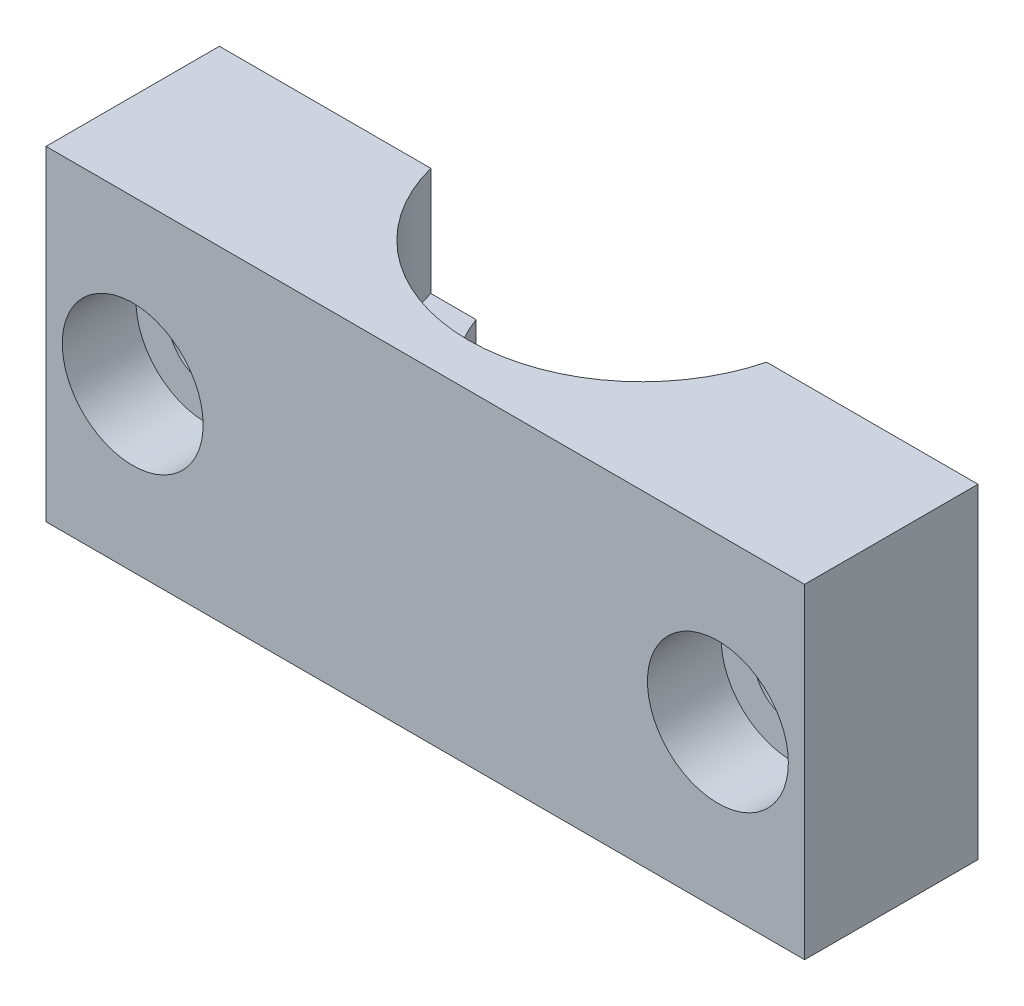
ISO-10303-21;
HEADER;
FILE_DESCRIPTION(('STEP AP214'),'2;1');
FILE_NAME('part.step','',(''),(''),'','','');
FILE_SCHEMA(('AUTOMOTIVE_DESIGN { 1 0 10303 214 1 1 1 1 }'));
ENDSEC;
DATA;
#1=APPLICATION_CONTEXT('core data for automotive mechanical design processes');
#2=APPLICATION_PROTOCOL_DEFINITION('international standard','automotive_design',2000,#1);
#3=PRODUCT_CONTEXT('',#1,'mechanical');
#4=PRODUCT('Part','Part','',(#3));
#5=PRODUCT_RELATED_PRODUCT_CATEGORY('part','',(#4));
#6=PRODUCT_DEFINITION_FORMATION('','',#4);
#7=PRODUCT_DEFINITION_CONTEXT('part definition',#1,'design');
#8=PRODUCT_DEFINITION('design','',#6,#7);
#9=PRODUCT_DEFINITION_SHAPE('','',#8);
#10=(LENGTH_UNIT() NAMED_UNIT(*) SI_UNIT(.MILLI.,.METRE.));
#11=(NAMED_UNIT(*) PLANE_ANGLE_UNIT() SI_UNIT($,.RADIAN.));
#12=(NAMED_UNIT(*) SI_UNIT($,.STERADIAN.) SOLID_ANGLE_UNIT());
#13=UNCERTAINTY_MEASURE_WITH_UNIT(LENGTH_MEASURE(1.E-05),#10,'distance_accuracy_value','');
#14=(GEOMETRIC_REPRESENTATION_CONTEXT(3) GLOBAL_UNCERTAINTY_ASSIGNED_CONTEXT((#13)) GLOBAL_UNIT_ASSIGNED_CONTEXT((#10,
#11,#12)) REPRESENTATION_CONTEXT('',''));
#15=CARTESIAN_POINT('',(0.,0.,0.));
#16=DIRECTION('',(0.,0.,1.));
#17=DIRECTION('',(1.,0.,0.));
#18=AXIS2_PLACEMENT_3D('',#15,#16,#17);
#19=CARTESIAN_POINT('',(17.5,-7.5,10.));
#20=DIRECTION('',(-1.,0.,0.));
#21=DIRECTION('',(0.,0.,1.));
#22=AXIS2_PLACEMENT_3D('',#19,#20,#21);
#23=PLANE('',#22);
#24=DIRECTION('',(0.,0.,-1.));
#25=VECTOR('',#24,1.);
#26=CARTESIAN_POINT('',(17.5,-7.5,10.));
#27=LINE('',#26,#25);
#28=CARTESIAN_POINT('',(17.5,-7.5,10.));
#29=VERTEX_POINT('',#28);
#30=CARTESIAN_POINT('',(17.5,-7.5,2.));
#31=VERTEX_POINT('',#30);
#32=EDGE_CURVE('E135',#29,#31,#27,.T.);
#33=ORIENTED_EDGE('',*,*,#32,.T.);
#34=DIRECTION('',(0.,1.,0.));
#35=VECTOR('',#34,1.);
#36=CARTESIAN_POINT('',(17.5,-7.5,2.));
#37=LINE('',#36,#35);
#38=CARTESIAN_POINT('',(17.5,7.5,2.));
#39=VERTEX_POINT('',#38);
#40=EDGE_CURVE('E130',#31,#39,#37,.T.);
#41=ORIENTED_EDGE('',*,*,#40,.T.);
#42=DIRECTION('',(0.,0.,-1.));
#43=VECTOR('',#42,1.);
#44=CARTESIAN_POINT('',(17.5,7.5,10.));
#45=LINE('',#44,#43);
#46=CARTESIAN_POINT('',(17.5,7.5,10.));
#47=VERTEX_POINT('',#46);
#48=EDGE_CURVE('E11',#47,#39,#45,.T.);
#49=ORIENTED_EDGE('',*,*,#48,.F.);
#50=DIRECTION('',(0.,1.,0.));
#51=VECTOR('',#50,1.);
#52=CARTESIAN_POINT('',(17.5,-7.5,10.));
#53=LINE('',#52,#51);
#54=EDGE_CURVE('E182',#29,#47,#53,.T.);
#55=ORIENTED_EDGE('',*,*,#54,.F.);
#56=EDGE_LOOP('',(#33,#41,#49,#55));
#57=FACE_BOUND('',#56,.T.);
#58=ADVANCED_FACE('F35',(#57),#23,.F.);
#59=CARTESIAN_POINT('',(-17.5,7.5,10.));
#60=DIRECTION('',(0.,-1.,0.));
#61=DIRECTION('',(0.,0.,-1.));
#62=AXIS2_PLACEMENT_3D('',#59,#60,#61);
#63=PLANE('',#62);
#64=ORIENTED_EDGE('',*,*,#48,.T.);
#65=DIRECTION('',(1.,0.,0.));
#66=VECTOR('',#65,1.);
#67=CARTESIAN_POINT('',(17.5,7.5,2.));
#68=LINE('',#67,#66);
#69=CARTESIAN_POINT('',(7.74596669241484,7.5,2.));
#70=VERTEX_POINT('',#69);
#71=EDGE_CURVE('E197',#70,#39,#68,.T.);
#72=ORIENTED_EDGE('',*,*,#71,.F.);
#73=CARTESIAN_POINT('',(0.,7.5,0.));
#74=DIRECTION('',(0.,-1.,0.));
#75=DIRECTION('',(0.,0.,-1.));
#76=AXIS2_PLACEMENT_3D('',#73,#74,#75);
#77=CIRCLE('',#76,8.);
#78=CARTESIAN_POINT('',(-7.74596669241483,7.5,2.));
#79=VERTEX_POINT('',#78);
#80=EDGE_CURVE('E179',#70,#79,#77,.T.);
#81=ORIENTED_EDGE('',*,*,#80,.T.);
#82=CARTESIAN_POINT('',(-17.5,7.5,2.));
#83=VERTEX_POINT('',#82);
#84=EDGE_CURVE('E199',#83,#79,#68,.T.);
#85=ORIENTED_EDGE('',*,*,#84,.F.);
#86=DIRECTION('',(0.,0.,-1.));
#87=VECTOR('',#86,1.);
#88=CARTESIAN_POINT('',(-17.5,7.5,10.));
#89=LINE('',#88,#87);
#90=CARTESIAN_POINT('',(-17.5,7.5,10.));
#91=VERTEX_POINT('',#90);
#92=EDGE_CURVE('E43',#91,#83,#89,.T.);
#93=ORIENTED_EDGE('',*,*,#92,.F.);
#94=DIRECTION('',(-1.,0.,0.));
#95=VECTOR('',#94,1.);
#96=CARTESIAN_POINT('',(-17.5,7.5,10.));
#97=LINE('',#96,#95);
#98=EDGE_CURVE('E185',#47,#91,#97,.T.);
#99=ORIENTED_EDGE('',*,*,#98,.F.);
#100=EDGE_LOOP('',(#64,#72,#81,#85,#93,#99));
#101=FACE_BOUND('',#100,.T.);
#102=ADVANCED_FACE('F196',(#101),#63,.F.);
#103=CARTESIAN_POINT('',(-17.5,-7.5,10.));
#104=DIRECTION('',(1.,0.,0.));
#105=DIRECTION('',(0.,0.,-1.));
#106=AXIS2_PLACEMENT_3D('',#103,#104,#105);
#107=PLANE('',#106);
#108=ORIENTED_EDGE('',*,*,#92,.T.);
#109=DIRECTION('',(0.,1.,0.));
#110=VECTOR('',#109,1.);
#111=CARTESIAN_POINT('',(-17.5,-7.5,2.));
#112=LINE('',#111,#110);
#113=CARTESIAN_POINT('',(-17.5,-7.5,2.));
#114=VERTEX_POINT('',#113);
#115=EDGE_CURVE('E114',#114,#83,#112,.T.);
#116=ORIENTED_EDGE('',*,*,#115,.F.);
#117=DIRECTION('',(0.,0.,-1.));
#118=VECTOR('',#117,1.);
#119=CARTESIAN_POINT('',(-17.5,-7.5,10.));
#120=LINE('',#119,#118);
#121=CARTESIAN_POINT('',(-17.5,-7.5,10.));
#122=VERTEX_POINT('',#121);
#123=EDGE_CURVE('E127',#122,#114,#120,.T.);
#124=ORIENTED_EDGE('',*,*,#123,.F.);
#125=DIRECTION('',(0.,-1.,0.));
#126=VECTOR('',#125,1.);
#127=CARTESIAN_POINT('',(-17.5,-7.5,10.));
#128=LINE('',#127,#126);
#129=EDGE_CURVE('E187',#91,#122,#128,.T.);
#130=ORIENTED_EDGE('',*,*,#129,.F.);
#131=EDGE_LOOP('',(#108,#116,#124,#130));
#132=FACE_BOUND('',#131,.T.);
#133=ADVANCED_FACE('F125',(#132),#107,.F.);
#134=CARTESIAN_POINT('',(-17.5,-7.5,10.));
#135=DIRECTION('',(0.,1.,0.));
#136=DIRECTION('',(0.,0.,1.));
#137=AXIS2_PLACEMENT_3D('',#134,#135,#136);
#138=PLANE('',#137);
#139=ORIENTED_EDGE('',*,*,#123,.T.);
#140=DIRECTION('',(1.,0.,0.));
#141=VECTOR('',#140,1.);
#142=CARTESIAN_POINT('',(17.5,-7.5,2.));
#143=LINE('',#142,#141);
#144=CARTESIAN_POINT('',(-7.74596669241483,-7.5,2.));
#145=VERTEX_POINT('',#144);
#146=EDGE_CURVE('E111',#114,#145,#143,.T.);
#147=ORIENTED_EDGE('',*,*,#146,.T.);
#148=CARTESIAN_POINT('',(0.,-7.5,0.));
#149=DIRECTION('',(0.,-1.,0.));
#150=DIRECTION('',(0.,0.,-1.));
#151=AXIS2_PLACEMENT_3D('',#148,#149,#150);
#152=CIRCLE('',#151,8.);
#153=CARTESIAN_POINT('',(7.74596669241484,-7.5,2.));
#154=VERTEX_POINT('',#153);
#155=EDGE_CURVE('E144',#154,#145,#152,.T.);
#156=ORIENTED_EDGE('',*,*,#155,.F.);
#157=EDGE_CURVE('E59',#154,#31,#143,.T.);
#158=ORIENTED_EDGE('',*,*,#157,.T.);
#159=ORIENTED_EDGE('',*,*,#32,.F.);
#160=DIRECTION('',(1.,0.,0.));
#161=VECTOR('',#160,1.);
#162=CARTESIAN_POINT('',(-17.5,-7.5,10.));
#163=LINE('',#162,#161);
#164=EDGE_CURVE('E134',#122,#29,#163,.T.);
#165=ORIENTED_EDGE('',*,*,#164,.F.);
#166=EDGE_LOOP('',(#139,#147,#156,#158,#159,#165));
#167=FACE_BOUND('',#166,.T.);
#168=ADVANCED_FACE('F132',(#167),#138,.F.);
#169=CARTESIAN_POINT('',(0.,0.,10.));
#170=DIRECTION('',(0.,0.,-1.));
#171=DIRECTION('',(-1.,0.,0.));
#172=AXIS2_PLACEMENT_3D('',#169,#170,#171);
#173=PLANE('',#172);
#174=CARTESIAN_POINT('',(-13.5,0.,10.));
#175=DIRECTION('',(0.,0.,1.));
#176=DIRECTION('',(1.,0.,0.));
#177=AXIS2_PLACEMENT_3D('',#174,#175,#176);
#178=CIRCLE('',#177,3.25);
#179=CARTESIAN_POINT('',(-10.25,0.,10.));
#180=VERTEX_POINT('',#179);
#181=EDGE_CURVE('E155',#180,#180,#178,.T.);
#182=ORIENTED_EDGE('',*,*,#181,.F.);
#183=EDGE_LOOP('',(#182));
#184=FACE_BOUND('',#183,.T.);
#185=CARTESIAN_POINT('',(13.5,0.,10.));
#186=DIRECTION('',(0.,0.,1.));
#187=DIRECTION('',(1.,0.,0.));
#188=AXIS2_PLACEMENT_3D('',#185,#186,#187);
#189=CIRCLE('',#188,3.25);
#190=CARTESIAN_POINT('',(16.75,0.,10.));
#191=VERTEX_POINT('',#190);
#192=EDGE_CURVE('E148',#191,#191,#189,.T.);
#193=ORIENTED_EDGE('',*,*,#192,.F.);
#194=EDGE_LOOP('',(#193));
#195=FACE_BOUND('',#194,.T.);
#196=ORIENTED_EDGE('',*,*,#54,.T.);
#197=ORIENTED_EDGE('',*,*,#98,.T.);
#198=ORIENTED_EDGE('',*,*,#129,.T.);
#199=ORIENTED_EDGE('',*,*,#164,.T.);
#200=EDGE_LOOP('',(#196,#197,#198,#199));
#201=FACE_BOUND('',#200,.T.);
#202=ADVANCED_FACE('F189',(#184,#195,#201),#173,.F.);
#203=CARTESIAN_POINT('',(0.,7.5,0.));
#204=DIRECTION('',(0.,-1.,0.));
#205=DIRECTION('',(0.,0.,-1.));
#206=AXIS2_PLACEMENT_3D('',#203,#204,#205);
#207=CYLINDRICAL_SURFACE('',#206,8.);
#208=CARTESIAN_POINT('',(0.,2.5,0.));
#209=DIRECTION('',(0.,-1.,0.));
#210=DIRECTION('',(0.,0.,-1.));
#211=AXIS2_PLACEMENT_3D('',#208,#209,#210);
#212=CIRCLE('',#211,8.);
#213=CARTESIAN_POINT('',(7.74596669241484,2.5,2.));
#214=VERTEX_POINT('',#213);
#215=CARTESIAN_POINT('',(-7.74596669241483,2.5,2.));
#216=VERTEX_POINT('',#215);
#217=EDGE_CURVE('E176',#214,#216,#212,.T.);
#218=ORIENTED_EDGE('',*,*,#217,.T.);
#219=DIRECTION('',(0.,-1.,0.));
#220=VECTOR('',#219,1.);
#221=CARTESIAN_POINT('',(-7.74596669241483,7.5,2.));
#222=LINE('',#221,#220);
#223=EDGE_CURVE('E160',#216,#79,#222,.F.);
#224=ORIENTED_EDGE('',*,*,#223,.T.);
#225=ORIENTED_EDGE('',*,*,#80,.F.);
#226=DIRECTION('',(0.,-1.,0.));
#227=VECTOR('',#226,1.);
#228=CARTESIAN_POINT('',(7.74596669241484,7.5,2.));
#229=LINE('',#228,#227);
#230=EDGE_CURVE('E218',#70,#214,#229,.T.);
#231=ORIENTED_EDGE('',*,*,#230,.T.);
#232=EDGE_LOOP('',(#218,#224,#225,#231));
#233=FACE_BOUND('',#232,.T.);
#234=ADVANCED_FACE('F231',(#233),#207,.F.);
#235=CARTESIAN_POINT('',(8.00000000000001,2.5,0.));
#236=DIRECTION('',(0.,-1.,0.));
#237=DIRECTION('',(0.,0.,-1.));
#238=AXIS2_PLACEMENT_3D('',#235,#236,#237);
#239=PLANE('',#238);
#240=ORIENTED_EDGE('',*,*,#217,.F.);
#241=DIRECTION('',(-1.,0.,0.));
#242=VECTOR('',#241,1.);
#243=CARTESIAN_POINT('',(8.00000000000001,2.5,2.));
#244=LINE('',#243,#242);
#245=CARTESIAN_POINT('',(5.65685424949239,2.5,2.));
#246=VERTEX_POINT('',#245);
#247=EDGE_CURVE('E215',#214,#246,#244,.T.);
#248=ORIENTED_EDGE('',*,*,#247,.T.);
#249=CARTESIAN_POINT('',(0.,2.5,0.));
#250=DIRECTION('',(0.,-1.,0.));
#251=DIRECTION('',(0.,0.,-1.));
#252=AXIS2_PLACEMENT_3D('',#249,#250,#251);
#253=CIRCLE('',#252,6.);
#254=CARTESIAN_POINT('',(-5.65685424949238,2.5,2.));
#255=VERTEX_POINT('',#254);
#256=EDGE_CURVE('E173',#246,#255,#253,.T.);
#257=ORIENTED_EDGE('',*,*,#256,.T.);
#258=EDGE_CURVE('E219',#255,#216,#244,.T.);
#259=ORIENTED_EDGE('',*,*,#258,.T.);
#260=EDGE_LOOP('',(#240,#248,#257,#259));
#261=FACE_BOUND('',#260,.T.);
#262=ADVANCED_FACE('F229',(#261),#239,.F.);
#263=CARTESIAN_POINT('',(0.,7.5,0.));
#264=DIRECTION('',(0.,-1.,0.));
#265=DIRECTION('',(0.,0.,-1.));
#266=AXIS2_PLACEMENT_3D('',#263,#264,#265);
#267=CYLINDRICAL_SURFACE('',#266,6.);
#268=CARTESIAN_POINT('',(0.,-3.5,0.));
#269=DIRECTION('',(0.,-1.,0.));
#270=DIRECTION('',(0.,0.,-1.));
#271=AXIS2_PLACEMENT_3D('',#268,#269,#270);
#272=CIRCLE('',#271,6.00000000000001);
#273=CARTESIAN_POINT('',(5.65685424949239,-3.5,2.));
#274=VERTEX_POINT('',#273);
#275=CARTESIAN_POINT('',(-5.65685424949238,-3.5,2.));
#276=VERTEX_POINT('',#275);
#277=EDGE_CURVE('E170',#274,#276,#272,.T.);
#278=ORIENTED_EDGE('',*,*,#277,.T.);
#279=DIRECTION('',(0.,-1.,0.));
#280=VECTOR('',#279,1.);
#281=CARTESIAN_POINT('',(-5.65685424949238,7.5,2.));
#282=LINE('',#281,#280);
#283=EDGE_CURVE('E223',#276,#255,#282,.F.);
#284=ORIENTED_EDGE('',*,*,#283,.T.);
#285=ORIENTED_EDGE('',*,*,#256,.F.);
#286=DIRECTION('',(0.,-1.,0.));
#287=VECTOR('',#286,1.);
#288=CARTESIAN_POINT('',(5.65685424949239,7.5,2.));
#289=LINE('',#288,#287);
#290=EDGE_CURVE('E212',#246,#274,#289,.T.);
#291=ORIENTED_EDGE('',*,*,#290,.T.);
#292=EDGE_LOOP('',(#278,#284,#285,#291));
#293=FACE_BOUND('',#292,.T.);
#294=ADVANCED_FACE('F234',(#293),#267,.F.);
#295=CARTESIAN_POINT('',(6.00000000000001,-3.5,0.));
#296=DIRECTION('',(0.,1.,0.));
#297=DIRECTION('',(0.,0.,1.));
#298=AXIS2_PLACEMENT_3D('',#295,#296,#297);
#299=PLANE('',#298);
#300=CARTESIAN_POINT('',(0.,-3.5,0.));
#301=DIRECTION('',(0.,-1.,0.));
#302=DIRECTION('',(0.,0.,-1.));
#303=AXIS2_PLACEMENT_3D('',#300,#301,#302);
#304=CIRCLE('',#303,8.);
#305=CARTESIAN_POINT('',(7.74596669241484,-3.5,2.));
#306=VERTEX_POINT('',#305);
#307=CARTESIAN_POINT('',(-7.74596669241483,-3.5,2.));
#308=VERTEX_POINT('',#307);
#309=EDGE_CURVE('E167',#306,#308,#304,.T.);
#310=ORIENTED_EDGE('',*,*,#309,.T.);
#311=DIRECTION('',(1.,0.,0.));
#312=VECTOR('',#311,1.);
#313=CARTESIAN_POINT('',(6.00000000000001,-3.5,2.));
#314=LINE('',#313,#312);
#315=EDGE_CURVE('E51',#308,#276,#314,.T.);
#316=ORIENTED_EDGE('',*,*,#315,.T.);
#317=ORIENTED_EDGE('',*,*,#277,.F.);
#318=EDGE_CURVE('E209',#274,#306,#314,.T.);
#319=ORIENTED_EDGE('',*,*,#318,.T.);
#320=EDGE_LOOP('',(#310,#316,#317,#319));
#321=FACE_BOUND('',#320,.T.);
#322=ADVANCED_FACE('F237',(#321),#299,.F.);
#323=CARTESIAN_POINT('',(0.,7.5,0.));
#324=DIRECTION('',(0.,-1.,0.));
#325=DIRECTION('',(0.,0.,-1.));
#326=AXIS2_PLACEMENT_3D('',#323,#324,#325);
#327=CYLINDRICAL_SURFACE('',#326,8.);
#328=ORIENTED_EDGE('',*,*,#155,.T.);
#329=DIRECTION('',(0.,-1.,0.));
#330=VECTOR('',#329,1.);
#331=CARTESIAN_POINT('',(-7.74596669241483,7.5,2.));
#332=LINE('',#331,#330);
#333=EDGE_CURVE('E116',#145,#308,#332,.F.);
#334=ORIENTED_EDGE('',*,*,#333,.T.);
#335=ORIENTED_EDGE('',*,*,#309,.F.);
#336=DIRECTION('',(0.,-1.,0.));
#337=VECTOR('',#336,1.);
#338=CARTESIAN_POINT('',(7.74596669241484,7.5,2.));
#339=LINE('',#338,#337);
#340=EDGE_CURVE('E207',#306,#154,#339,.T.);
#341=ORIENTED_EDGE('',*,*,#340,.T.);
#342=EDGE_LOOP('',(#328,#334,#335,#341));
#343=FACE_BOUND('',#342,.T.);
#344=ADVANCED_FACE('F240',(#343),#327,.F.);
#345=CARTESIAN_POINT('',(-13.5,0.,0.));
#346=DIRECTION('',(0.,0.,1.));
#347=DIRECTION('',(1.,0.,0.));
#348=AXIS2_PLACEMENT_3D('',#345,#346,#347);
#349=CYLINDRICAL_SURFACE('',#348,1.75);
#350=CARTESIAN_POINT('',(-13.5,0.,2.));
#351=DIRECTION('',(0.,0.,1.));
#352=DIRECTION('',(1.,0.,0.));
#353=AXIS2_PLACEMENT_3D('',#350,#351,#352);
#354=CIRCLE('',#353,1.75);
#355=CARTESIAN_POINT('',(-11.75,0.,2.));
#356=VERTEX_POINT('',#355);
#357=EDGE_CURVE('E204',#356,#356,#354,.F.);
#358=ORIENTED_EDGE('',*,*,#357,.T.);
#359=EDGE_LOOP('',(#358));
#360=FACE_BOUND('',#359,.T.);
#361=CARTESIAN_POINT('',(-13.5,0.,6.6));
#362=DIRECTION('',(0.,0.,-1.));
#363=DIRECTION('',(-1.,0.,0.));
#364=AXIS2_PLACEMENT_3D('',#361,#362,#363);
#365=CIRCLE('',#364,1.75);
#366=CARTESIAN_POINT('',(-15.25,0.,6.6));
#367=VERTEX_POINT('',#366);
#368=EDGE_CURVE('E146',#367,#367,#365,.F.);
#369=ORIENTED_EDGE('',*,*,#368,.T.);
#370=EDGE_LOOP('',(#369));
#371=FACE_BOUND('',#370,.T.);
#372=ADVANCED_FACE('F242',(#360,#371),#349,.F.);
#373=CARTESIAN_POINT('',(13.5,0.,0.));
#374=DIRECTION('',(0.,0.,1.));
#375=DIRECTION('',(1.,0.,0.));
#376=AXIS2_PLACEMENT_3D('',#373,#374,#375);
#377=CYLINDRICAL_SURFACE('',#376,1.75);
#378=CARTESIAN_POINT('',(13.5,0.,2.));
#379=DIRECTION('',(0.,0.,1.));
#380=DIRECTION('',(1.,0.,0.));
#381=AXIS2_PLACEMENT_3D('',#378,#379,#380);
#382=CIRCLE('',#381,1.75);
#383=CARTESIAN_POINT('',(15.25,0.,2.));
#384=VERTEX_POINT('',#383);
#385=EDGE_CURVE('E38',#384,#384,#382,.F.);
#386=ORIENTED_EDGE('',*,*,#385,.T.);
#387=EDGE_LOOP('',(#386));
#388=FACE_BOUND('',#387,.T.);
#389=CARTESIAN_POINT('',(13.5,0.,6.6));
#390=DIRECTION('',(0.,0.,-1.));
#391=DIRECTION('',(-1.,0.,0.));
#392=AXIS2_PLACEMENT_3D('',#389,#390,#391);
#393=CIRCLE('',#392,1.75);
#394=CARTESIAN_POINT('',(11.75,0.,6.6));
#395=VERTEX_POINT('',#394);
#396=EDGE_CURVE('E142',#395,#395,#393,.F.);
#397=ORIENTED_EDGE('',*,*,#396,.T.);
#398=EDGE_LOOP('',(#397));
#399=FACE_BOUND('',#398,.T.);
#400=ADVANCED_FACE('F248',(#388,#399),#377,.F.);
#401=CARTESIAN_POINT('',(15.2,0.,6.6));
#402=DIRECTION('',(0.,0.,-1.));
#403=DIRECTION('',(-1.,0.,0.));
#404=AXIS2_PLACEMENT_3D('',#401,#402,#403);
#405=PLANE('',#404);
#406=CARTESIAN_POINT('',(13.5,0.,6.6));
#407=DIRECTION('',(0.,0.,1.));
#408=DIRECTION('',(1.,0.,0.));
#409=AXIS2_PLACEMENT_3D('',#406,#407,#408);
#410=CIRCLE('',#409,3.25);
#411=CARTESIAN_POINT('',(16.75,0.,6.6));
#412=VERTEX_POINT('',#411);
#413=EDGE_CURVE('E145',#412,#412,#410,.T.);
#414=ORIENTED_EDGE('',*,*,#413,.T.);
#415=EDGE_LOOP('',(#414));
#416=FACE_BOUND('',#415,.T.);
#417=ORIENTED_EDGE('',*,*,#396,.F.);
#418=EDGE_LOOP('',(#417));
#419=FACE_BOUND('',#418,.T.);
#420=ADVANCED_FACE('F299',(#416,#419),#405,.F.);
#421=CARTESIAN_POINT('',(13.5,0.,10.));
#422=DIRECTION('',(0.,0.,1.));
#423=DIRECTION('',(1.,0.,0.));
#424=AXIS2_PLACEMENT_3D('',#421,#422,#423);
#425=CYLINDRICAL_SURFACE('',#424,3.25);
#426=ORIENTED_EDGE('',*,*,#413,.F.);
#427=EDGE_LOOP('',(#426));
#428=FACE_BOUND('',#427,.T.);
#429=ORIENTED_EDGE('',*,*,#192,.T.);
#430=EDGE_LOOP('',(#429));
#431=FACE_BOUND('',#430,.T.);
#432=ADVANCED_FACE('F332',(#428,#431),#425,.F.);
#433=CARTESIAN_POINT('',(-11.8,0.,6.6));
#434=DIRECTION('',(0.,0.,-1.));
#435=DIRECTION('',(-1.,0.,0.));
#436=AXIS2_PLACEMENT_3D('',#433,#434,#435);
#437=PLANE('',#436);
#438=CARTESIAN_POINT('',(-13.5,0.,6.6));
#439=DIRECTION('',(0.,0.,1.));
#440=DIRECTION('',(1.,0.,0.));
#441=AXIS2_PLACEMENT_3D('',#438,#439,#440);
#442=CIRCLE('',#441,3.25);
#443=CARTESIAN_POINT('',(-10.25,0.,6.6));
#444=VERTEX_POINT('',#443);
#445=EDGE_CURVE('E149',#444,#444,#442,.T.);
#446=ORIENTED_EDGE('',*,*,#445,.T.);
#447=EDGE_LOOP('',(#446));
#448=FACE_BOUND('',#447,.T.);
#449=ORIENTED_EDGE('',*,*,#368,.F.);
#450=EDGE_LOOP('',(#449));
#451=FACE_BOUND('',#450,.T.);
#452=ADVANCED_FACE('F328',(#448,#451),#437,.F.);
#453=CARTESIAN_POINT('',(-13.5,0.,10.));
#454=DIRECTION('',(0.,0.,1.));
#455=DIRECTION('',(1.,0.,0.));
#456=AXIS2_PLACEMENT_3D('',#453,#454,#455);
#457=CYLINDRICAL_SURFACE('',#456,3.25);
#458=ORIENTED_EDGE('',*,*,#445,.F.);
#459=EDGE_LOOP('',(#458));
#460=FACE_BOUND('',#459,.T.);
#461=ORIENTED_EDGE('',*,*,#181,.T.);
#462=EDGE_LOOP('',(#461));
#463=FACE_BOUND('',#462,.T.);
#464=ADVANCED_FACE('F310',(#460,#463),#457,.F.);
#465=CARTESIAN_POINT('',(17.5,-7.5,2.));
#466=DIRECTION('',(0.,0.,1.));
#467=DIRECTION('',(1.,0.,0.));
#468=AXIS2_PLACEMENT_3D('',#465,#466,#467);
#469=PLANE('',#468);
#470=ORIENTED_EDGE('',*,*,#385,.F.);
#471=EDGE_LOOP('',(#470));
#472=FACE_BOUND('',#471,.T.);
#473=ORIENTED_EDGE('',*,*,#71,.T.);
#474=ORIENTED_EDGE('',*,*,#40,.F.);
#475=ORIENTED_EDGE('',*,*,#157,.F.);
#476=ORIENTED_EDGE('',*,*,#340,.F.);
#477=ORIENTED_EDGE('',*,*,#318,.F.);
#478=ORIENTED_EDGE('',*,*,#290,.F.);
#479=ORIENTED_EDGE('',*,*,#247,.F.);
#480=ORIENTED_EDGE('',*,*,#230,.F.);
#481=EDGE_LOOP('',(#473,#474,#475,#476,#477,#478,#479,#480));
#482=FACE_BOUND('',#481,.T.);
#483=ADVANCED_FACE('F232',(#472,#482),#469,.F.);
#484=ORIENTED_EDGE('',*,*,#357,.F.);
#485=EDGE_LOOP('',(#484));
#486=FACE_BOUND('',#485,.T.);
#487=ORIENTED_EDGE('',*,*,#258,.F.);
#488=ORIENTED_EDGE('',*,*,#283,.F.);
#489=ORIENTED_EDGE('',*,*,#315,.F.);
#490=ORIENTED_EDGE('',*,*,#333,.F.);
#491=ORIENTED_EDGE('',*,*,#146,.F.);
#492=ORIENTED_EDGE('',*,*,#115,.T.);
#493=ORIENTED_EDGE('',*,*,#84,.T.);
#494=ORIENTED_EDGE('',*,*,#223,.F.);
#495=EDGE_LOOP('',(#487,#488,#489,#490,#491,#492,#493,#494));
#496=FACE_BOUND('',#495,.T.);
#497=ADVANCED_FACE('F113',(#486,#496),#469,.F.);
#498=CLOSED_SHELL('',(#58,#102,#133,#168,#202,#234,#262,#294,#322,#344,#372,#400,#420,#432,#452,
#464,#483,#497));
#499=MANIFOLD_SOLID_BREP('B2',#498);
#500=ADVANCED_BREP_SHAPE_REPRESENTATION('',(#18,#499),#14);
#501=SHAPE_DEFINITION_REPRESENTATION(#9,#500);
ENDSEC;
END-ISO-10303-21;
